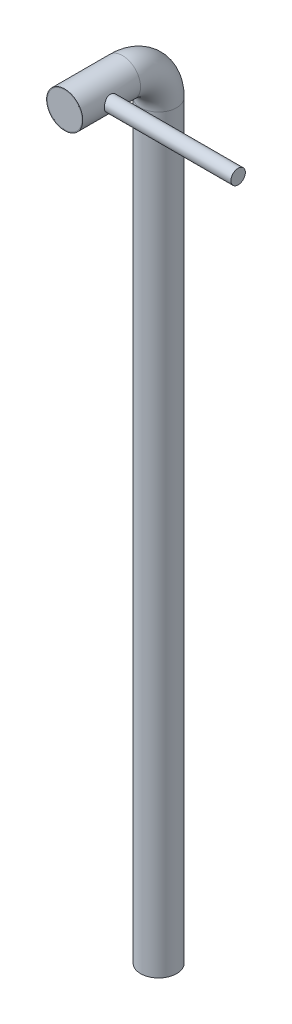
ISO-10303-21;
HEADER;
FILE_DESCRIPTION(('STEP AP214'),'2;1');
FILE_NAME('part.step','',(''),(''),'','','');
FILE_SCHEMA(('AUTOMOTIVE_DESIGN { 1 0 10303 214 1 1 1 1 }'));
ENDSEC;
DATA;
#1=APPLICATION_CONTEXT('core data for automotive mechanical design processes');
#2=APPLICATION_PROTOCOL_DEFINITION('international standard','automotive_design',2000,#1);
#3=PRODUCT_CONTEXT('',#1,'mechanical');
#4=PRODUCT('Part','Part','',(#3));
#5=PRODUCT_RELATED_PRODUCT_CATEGORY('part','',(#4));
#6=PRODUCT_DEFINITION_FORMATION('','',#4);
#7=PRODUCT_DEFINITION_CONTEXT('part definition',#1,'design');
#8=PRODUCT_DEFINITION('design','',#6,#7);
#9=PRODUCT_DEFINITION_SHAPE('','',#8);
#10=(LENGTH_UNIT() NAMED_UNIT(*) SI_UNIT(.MILLI.,.METRE.));
#11=(NAMED_UNIT(*) PLANE_ANGLE_UNIT() SI_UNIT($,.RADIAN.));
#12=(NAMED_UNIT(*) SI_UNIT($,.STERADIAN.) SOLID_ANGLE_UNIT());
#13=UNCERTAINTY_MEASURE_WITH_UNIT(LENGTH_MEASURE(1.E-05),#10,'distance_accuracy_value','');
#14=(GEOMETRIC_REPRESENTATION_CONTEXT(3) GLOBAL_UNCERTAINTY_ASSIGNED_CONTEXT((#13)) GLOBAL_UNIT_ASSIGNED_CONTEXT((#10,
#11,#12)) REPRESENTATION_CONTEXT('',''));
#15=CARTESIAN_POINT('',(0.,0.,0.));
#16=DIRECTION('',(0.,0.,1.));
#17=DIRECTION('',(1.,0.,0.));
#18=AXIS2_PLACEMENT_3D('',#15,#16,#17);
#19=CARTESIAN_POINT('',(0.,0.,13.));
#20=DIRECTION('',(0.,0.,-1.));
#21=DIRECTION('',(-1.,0.,0.));
#22=AXIS2_PLACEMENT_3D('',#19,#20,#21);
#23=PLANE('',#22);
#24=CARTESIAN_POINT('',(0.,80.,13.));
#25=DIRECTION('',(0.,0.,-1.));
#26=DIRECTION('',(-1.,0.,0.));
#27=AXIS2_PLACEMENT_3D('',#24,#25,#26);
#28=CIRCLE('',#27,2.4);
#29=CARTESIAN_POINT('',(-2.4,80.,13.));
#30=VERTEX_POINT('',#29);
#31=EDGE_CURVE('E12',#30,#30,#28,.F.);
#32=ORIENTED_EDGE('',*,*,#31,.F.);
#33=EDGE_LOOP('',(#32));
#34=FACE_BOUND('',#33,.T.);
#35=ADVANCED_FACE('F46',(#34),#23,.T.);
#36=OPEN_SHELL('',(#35));
#37=SHELL_BASED_SURFACE_MODEL('B2',(#36));
#38=CARTESIAN_POINT('',(0.,-28.77,0.));
#39=DIRECTION('',(0.,1.,0.));
#40=DIRECTION('',(1.,0.,0.));
#41=AXIS2_PLACEMENT_3D('',#38,#39,#40);
#42=PLANE('',#41);
#43=CARTESIAN_POINT('',(0.,-28.77,0.));
#44=DIRECTION('',(0.,1.,0.));
#45=DIRECTION('',(1.,0.,0.));
#46=AXIS2_PLACEMENT_3D('',#43,#44,#45);
#47=CIRCLE('',#46,2.5);
#48=CARTESIAN_POINT('',(2.5,-28.77,0.));
#49=VERTEX_POINT('',#48);
#50=EDGE_CURVE('E87',#49,#49,#47,.T.);
#51=ORIENTED_EDGE('',*,*,#50,.F.);
#52=EDGE_LOOP('',(#51));
#53=FACE_BOUND('',#52,.T.);
#54=ADVANCED_FACE('F63',(#53),#42,.F.);
#55=CARTESIAN_POINT('',(0.,80.,13.));
#56=DIRECTION('',(0.,0.,1.));
#57=DIRECTION('',(1.,0.,0.));
#58=AXIS2_PLACEMENT_3D('',#55,#56,#57);
#59=PLANE('',#58);
#60=CARTESIAN_POINT('',(0.,80.,13.));
#61=DIRECTION('',(0.,0.,1.));
#62=DIRECTION('',(1.,0.,0.));
#63=AXIS2_PLACEMENT_3D('',#60,#61,#62);
#64=CIRCLE('',#63,2.4);
#65=CARTESIAN_POINT('',(2.4,80.,13.));
#66=VERTEX_POINT('',#65);
#67=EDGE_CURVE('E90',#66,#66,#64,.T.);
#68=ORIENTED_EDGE('',*,*,#67,.F.);
#69=EDGE_LOOP('',(#68));
#70=FACE_BOUND('',#69,.T.);
#71=CARTESIAN_POINT('',(0.,80.,13.));
#72=DIRECTION('',(0.,0.,1.));
#73=DIRECTION('',(1.,0.,0.));
#74=AXIS2_PLACEMENT_3D('',#71,#72,#73);
#75=CIRCLE('',#74,2.5);
#76=CARTESIAN_POINT('',(2.5,80.,13.));
#77=VERTEX_POINT('',#76);
#78=EDGE_CURVE('E74',#77,#77,#75,.T.);
#79=ORIENTED_EDGE('',*,*,#78,.T.);
#80=EDGE_LOOP('',(#79));
#81=FACE_BOUND('',#80,.T.);
#82=ADVANCED_FACE('F134',(#70,#81),#59,.T.);
#83=CARTESIAN_POINT('',(0.,-28.77,0.));
#84=DIRECTION('',(0.,1.,0.));
#85=DIRECTION('',(0.,0.,1.));
#86=AXIS2_PLACEMENT_3D('',#83,#84,#85);
#87=CYLINDRICAL_SURFACE('',#86,2.5);
#88=CARTESIAN_POINT('',(0.,75.,0.));
#89=DIRECTION('',(0.,1.,0.));
#90=DIRECTION('',(1.,0.,0.));
#91=AXIS2_PLACEMENT_3D('',#88,#89,#90);
#92=CIRCLE('',#91,2.5);
#93=CARTESIAN_POINT('',(0.,75.,-2.5));
#94=VERTEX_POINT('',#93);
#95=EDGE_CURVE('E82',#94,#94,#92,.T.);
#96=ORIENTED_EDGE('',*,*,#95,.F.);
#97=EDGE_LOOP('',(#96));
#98=FACE_BOUND('',#97,.T.);
#99=ORIENTED_EDGE('',*,*,#50,.T.);
#100=EDGE_LOOP('',(#99));
#101=FACE_BOUND('',#100,.T.);
#102=ADVANCED_FACE('F128',(#98,#101),#87,.T.);
#103=CARTESIAN_POINT('',(0.,75.,5.));
#104=DIRECTION('',(1.,0.,0.));
#105=DIRECTION('',(0.,0.,-1.));
#106=AXIS2_PLACEMENT_3D('',#103,#104,#105);
#107=TOROIDAL_SURFACE('',#106,5.,2.5);
#108=CARTESIAN_POINT('',(0.,80.,4.99999999999999));
#109=DIRECTION('',(0.,0.,1.));
#110=DIRECTION('',(1.,0.,0.));
#111=AXIS2_PLACEMENT_3D('',#108,#109,#110);
#112=CIRCLE('',#111,2.5);
#113=CARTESIAN_POINT('',(0.,82.5,4.99999999999998));
#114=VERTEX_POINT('',#113);
#115=EDGE_CURVE('E78',#114,#114,#112,.T.);
#116=CARTESIAN_POINT('',(0.,75.,5.));
#117=DIRECTION('',(1.,0.,0.));
#118=DIRECTION('',(0.,0.,-1.));
#119=AXIS2_PLACEMENT_3D('',#116,#117,#118);
#120=CIRCLE('',#119,7.5);
#121=EDGE_CURVE('',#94,#114,#120,.T.);
#122=ORIENTED_EDGE('',*,*,#95,.T.);
#123=ORIENTED_EDGE('',*,*,#115,.F.);
#124=ORIENTED_EDGE('',*,*,#121,.T.);
#125=ORIENTED_EDGE('',*,*,#121,.F.);
#126=EDGE_LOOP('',(#122,#124,#123,#125));
#127=FACE_BOUND('',#126,.T.);
#128=ADVANCED_FACE('F123',(#127),#107,.T.);
#129=CARTESIAN_POINT('',(0.,80.,5.));
#130=DIRECTION('',(0.,0.,1.));
#131=DIRECTION('',(1.,0.,0.));
#132=AXIS2_PLACEMENT_3D('',#129,#130,#131);
#133=CYLINDRICAL_SURFACE('',#132,2.5);
#134=CARTESIAN_POINT('',(2.5,80.,8.));
#135=CARTESIAN_POINT('',(2.49999635613543,80.0537465027215,8.00000492591186));
#136=CARTESIAN_POINT('',(2.49824647153467,80.1075862820453,8.00435887604418));
#137=CARTESIAN_POINT('',(2.49141726550321,80.213748240209,8.02162385176062));
#138=CARTESIAN_POINT('',(2.48632889349439,80.2660658887806,8.03455813954307));
#139=CARTESIAN_POINT('',(2.47337104606559,80.3674769613637,8.06843803902942));
#140=CARTESIAN_POINT('',(2.46551068182036,80.4165803308085,8.08935742310836));
#141=CARTESIAN_POINT('',(2.44778305398039,80.5105359851642,8.13850958666327));
#142=CARTESIAN_POINT('',(2.43791648729028,80.5553897383755,8.16673982745946));
#143=CARTESIAN_POINT('',(2.41665443085209,80.6417505037852,8.23111774928047));
#144=CARTESIAN_POINT('',(2.40521148464595,80.6830311362751,8.26755332812013));
#145=CARTESIAN_POINT('',(2.38230288453097,80.7590875023924,8.34670000173839));
#146=CARTESIAN_POINT('',(2.37083722226896,80.7938600535668,8.38941414860588));
#147=CARTESIAN_POINT('',(2.34861395898568,80.8574372836464,8.48221403512114));
#148=CARTESIAN_POINT('',(2.33791057982476,80.8859074905977,8.53254324301161));
#149=CARTESIAN_POINT('',(2.31916823593396,80.9338773595186,8.63776819921003));
#150=CARTESIAN_POINT('',(2.31112800622088,80.9533812821429,8.69266176392419));
#151=CARTESIAN_POINT('',(2.29913178830409,80.981949411698,8.80285616679606));
#152=CARTESIAN_POINT('',(2.29500710177803,80.9914469829028,8.85802561778812));
#153=CARTESIAN_POINT('',(2.29082002024572,81.00108648082,8.96931749915364));
#154=CARTESIAN_POINT('',(2.29075562761384,81.0012330081566,9.02543944731251));
#155=CARTESIAN_POINT('',(2.29455250139997,80.9924946837523,9.13287833572903));
#156=CARTESIAN_POINT('',(2.29814087519225,80.9842376571526,9.18425785720452));
#157=CARTESIAN_POINT('',(2.30838093803918,80.9599734401489,9.28482977800336));
#158=CARTESIAN_POINT('',(2.31503316160837,80.9439648974023,9.33402179405516));
#159=CARTESIAN_POINT('',(2.33079742544265,80.9043473662755,9.43000891809803));
#160=CARTESIAN_POINT('',(2.33995689640394,80.8805899311577,9.47673461952735));
#161=CARTESIAN_POINT('',(2.35969058194945,80.8262532303661,9.56570790818079));
#162=CARTESIAN_POINT('',(2.37026532728425,80.7956714025504,9.60795380470141));
#163=CARTESIAN_POINT('',(2.39263368371136,80.7257752997272,9.69020486440101));
#164=CARTESIAN_POINT('',(2.40445832488076,80.6859687314853,9.72978436472301));
#165=CARTESIAN_POINT('',(2.42729912479141,80.6001572137151,9.80184223900103));
#166=CARTESIAN_POINT('',(2.43831512222663,80.5541510326672,9.83431919870515));
#167=CARTESIAN_POINT('',(2.45857340632274,80.4560388263029,9.89180872370792));
#168=CARTESIAN_POINT('',(2.46777635047708,80.4038302456732,9.91666114059853));
#169=CARTESIAN_POINT('',(2.4830741416438,80.2955118827414,9.95708393053903));
#170=CARTESIAN_POINT('',(2.48917056731191,80.2394040984248,9.97265901877871));
#171=CARTESIAN_POINT('',(2.49728069753456,80.1284479438039,9.99322414770985));
#172=CARTESIAN_POINT('',(2.49951472916757,80.0737216469928,9.99878622712678));
#173=CARTESIAN_POINT('',(2.50034239255316,79.9640773450961,10.0008565502643));
#174=CARTESIAN_POINT('',(2.49893696791146,79.909159393388,9.99736714077376));
#175=CARTESIAN_POINT('',(2.49278783531877,79.803283630439,9.98185412372401));
#176=CARTESIAN_POINT('',(2.48819695672762,79.7522587541123,9.97022100982451));
#177=CARTESIAN_POINT('',(2.4762972070275,79.6529322859696,9.93928214584509));
#178=CARTESIAN_POINT('',(2.46898798678265,79.6046310448876,9.91997541016566));
#179=CARTESIAN_POINT('',(2.45208297385406,79.5104606070916,9.87360753016002));
#180=CARTESIAN_POINT('',(2.44242407989902,79.4647109886223,9.84632726397842));
#181=CARTESIAN_POINT('',(2.42186682372762,79.3782782043767,9.78502983804717));
#182=CARTESIAN_POINT('',(2.41096796555135,79.3375970796194,9.75100997853868));
#183=CARTESIAN_POINT('',(2.38822558819056,79.2596384784856,9.67456499352517));
#184=CARTESIAN_POINT('',(2.37636720712526,79.222763033097,9.63173322924688));
#185=CARTESIAN_POINT('',(2.35370836458566,79.1566244012931,9.5402799584953));
#186=CARTESIAN_POINT('',(2.34290807763255,79.1273624693312,9.49165749983002));
#187=CARTESIAN_POINT('',(2.32357149953854,79.0770962490342,9.38926915270295));
#188=CARTESIAN_POINT('',(2.31505815442394,79.0561747027328,9.33545800039385));
#189=CARTESIAN_POINT('',(2.30161836738966,79.0238518901473,9.22463317414242));
#190=CARTESIAN_POINT('',(2.29668927847999,79.0124435973653,9.16762189709378));
#191=CARTESIAN_POINT('',(2.29135879649963,79.0001421913608,9.05643604911272));
#192=CARTESIAN_POINT('',(2.29065710504086,78.9985514588486,9.00235258020332));
#193=CARTESIAN_POINT('',(2.29307418016549,79.0040984203612,8.89472757114335));
#194=CARTESIAN_POINT('',(2.29619246162397,79.0112350060431,8.8411859630487));
#195=CARTESIAN_POINT('',(2.3056332453951,79.0334643169232,8.73833390507247));
#196=CARTESIAN_POINT('',(2.31182415913725,79.0482312532145,8.6889398627835));
#197=CARTESIAN_POINT('',(2.32662000616348,79.0849972757545,8.59331068519325));
#198=CARTESIAN_POINT('',(2.33522560603004,79.1069983593031,8.54707642655008));
#199=CARTESIAN_POINT('',(2.35449304802246,79.1590636186201,8.4561951903646));
#200=CARTESIAN_POINT('',(2.36524441156621,79.1895173324203,8.41179066493475));
#201=CARTESIAN_POINT('',(2.38731902186119,79.2570539403643,8.32850334139811));
#202=CARTESIAN_POINT('',(2.39864244024204,79.2941388325909,8.28962221393583));
#203=CARTESIAN_POINT('',(2.42146783543697,79.3767472468638,8.21589857336818));
#204=CARTESIAN_POINT('',(2.43293378981093,79.4226619994269,8.18148134655096));
#205=CARTESIAN_POINT('',(2.45400203356859,79.5200498398571,8.12083147868918));
#206=CARTESIAN_POINT('',(2.46360345546453,79.5715254977264,8.09460264392373));
#207=CARTESIAN_POINT('',(2.47969857407931,79.6776309687524,8.05168889240485));
#208=CARTESIAN_POINT('',(2.48624681527514,79.7321841908902,8.03483533821983));
#209=CARTESIAN_POINT('',(2.49572153104683,79.8435617268594,8.01068043952286));
#210=CARTESIAN_POINT('',(2.49865949747819,79.9003782370706,8.00334878162804));
#211=CARTESIAN_POINT('',(2.49987949752068,79.9715438510545,8.00030230951086));
#212=CARTESIAN_POINT('',(2.50000096484588,79.9857686556296,7.9999986956854));
#213=CARTESIAN_POINT('',(2.5,80.,8.));
#214=B_SPLINE_CURVE_WITH_KNOTS('',3,(#134,#135,#136,#137,#138,#139,#140,#141,#142,#143,#144,
#145,#146,#147,#148,#149,#150,#151,#152,#153,#154,#155,#156,#157,#158,#159,#160,#161,#162,#163,
#164,#165,#166,#167,#168,#169,#170,#171,#172,#173,#174,#175,#176,#177,#178,#179,#180,#181,#182,
#183,#184,#185,#186,#187,#188,#189,#190,#191,#192,#193,#194,#195,#196,#197,#198,#199,#200,#201,
#202,#203,#204,#205,#206,#207,#208,#209,#210,#211,#212,#213),.UNSPECIFIED.,.T.,.F.,(4,2,2,2,2,2,
2,2,2,2,2,2,2,2,2,2,2,2,2,2,2,2,2,2,2,2,2,2,2,2,2,2,2,2,2,2,2,2,2,4),(0.,0.161201493946544,
0.322841818003976,0.483955728735808,0.645013767839929,0.812986908502003,0.981041974672069,
1.15657629409611,1.33202711559136,1.49952052654416,1.66693153170246,1.82269164200687,
1.97847893628026,2.1374456314941,2.29647210969094,2.4677917459328,2.63914546419868,
2.81388456581404,2.98853478056897,3.15284592264005,3.31711446785043,3.47400227782184,
3.630910244969,3.79261756699134,3.95438979749488,4.1268423731221,4.29932334521876,
4.47347522570416,4.64749836322969,4.80899836696376,4.97047786281526,5.12557159274387,
5.28070817902584,5.4447273402835,5.60879600674199,5.78350211766921,5.95828931820269,
6.12982150506662,6.30080626202173,6.343490229484),.UNSPECIFIED.);
#215=CARTESIAN_POINT('',(2.5,80.,8.));
#216=VERTEX_POINT('',#215);
#217=EDGE_CURVE('E45',#216,#216,#214,.T.);
#218=ORIENTED_EDGE('',*,*,#217,.F.);
#219=EDGE_LOOP('',(#218));
#220=FACE_BOUND('',#219,.T.);
#221=ORIENTED_EDGE('',*,*,#78,.F.);
#222=EDGE_LOOP('',(#221));
#223=FACE_BOUND('',#222,.T.);
#224=ORIENTED_EDGE('',*,*,#115,.T.);
#225=EDGE_LOOP('',(#224));
#226=FACE_BOUND('',#225,.T.);
#227=ADVANCED_FACE('F120',(#220,#223,#226),#133,.T.);
#228=CARTESIAN_POINT('',(0.,-28.67,0.));
#229=DIRECTION('',(0.,1.,0.));
#230=DIRECTION('',(1.,0.,0.));
#231=AXIS2_PLACEMENT_3D('',#228,#229,#230);
#232=PLANE('',#231);
#233=CARTESIAN_POINT('',(0.,-28.67,0.));
#234=DIRECTION('',(0.,1.,0.));
#235=DIRECTION('',(0.,0.,1.));
#236=AXIS2_PLACEMENT_3D('',#233,#234,#235);
#237=CIRCLE('',#236,2.4);
#238=CARTESIAN_POINT('',(0.,-28.67,2.4));
#239=VERTEX_POINT('',#238);
#240=EDGE_CURVE('E99',#239,#239,#237,.T.);
#241=ORIENTED_EDGE('',*,*,#240,.T.);
#242=EDGE_LOOP('',(#241));
#243=FACE_BOUND('',#242,.T.);
#244=ADVANCED_FACE('F110',(#243),#232,.T.);
#245=CARTESIAN_POINT('',(0.,-28.77,0.));
#246=DIRECTION('',(0.,1.,0.));
#247=DIRECTION('',(0.,0.,1.));
#248=AXIS2_PLACEMENT_3D('',#245,#246,#247);
#249=CYLINDRICAL_SURFACE('',#248,2.4);
#250=CARTESIAN_POINT('',(0.,75.,0.));
#251=DIRECTION('',(0.,-1.,0.));
#252=DIRECTION('',(0.,0.,-1.));
#253=AXIS2_PLACEMENT_3D('',#250,#251,#252);
#254=CIRCLE('',#253,2.4);
#255=CARTESIAN_POINT('',(0.,75.,-2.4));
#256=VERTEX_POINT('',#255);
#257=EDGE_CURVE('E96',#256,#256,#254,.F.);
#258=ORIENTED_EDGE('',*,*,#257,.T.);
#259=EDGE_LOOP('',(#258));
#260=FACE_BOUND('',#259,.T.);
#261=ORIENTED_EDGE('',*,*,#240,.F.);
#262=EDGE_LOOP('',(#261));
#263=FACE_BOUND('',#262,.T.);
#264=ADVANCED_FACE('F119',(#260,#263),#249,.F.);
#265=CARTESIAN_POINT('',(0.,75.,5.));
#266=DIRECTION('',(1.,0.,0.));
#267=DIRECTION('',(0.,0.,-1.));
#268=AXIS2_PLACEMENT_3D('',#265,#266,#267);
#269=TOROIDAL_SURFACE('',#268,5.,2.4);
#270=CARTESIAN_POINT('',(0.,80.,4.99999999999999));
#271=DIRECTION('',(0.,0.,1.));
#272=DIRECTION('',(1.,0.,0.));
#273=AXIS2_PLACEMENT_3D('',#270,#271,#272);
#274=CIRCLE('',#273,2.4);
#275=CARTESIAN_POINT('',(0.,82.4,4.99999999999998));
#276=VERTEX_POINT('',#275);
#277=EDGE_CURVE('E93',#276,#276,#274,.T.);
#278=CARTESIAN_POINT('',(0.,75.,5.));
#279=DIRECTION('',(1.,0.,0.));
#280=DIRECTION('',(0.,0.,-1.));
#281=AXIS2_PLACEMENT_3D('',#278,#279,#280);
#282=CIRCLE('',#281,7.4);
#283=EDGE_CURVE('',#256,#276,#282,.T.);
#284=ORIENTED_EDGE('',*,*,#257,.F.);
#285=ORIENTED_EDGE('',*,*,#277,.T.);
#286=ORIENTED_EDGE('',*,*,#283,.T.);
#287=ORIENTED_EDGE('',*,*,#283,.F.);
#288=EDGE_LOOP('',(#284,#286,#285,#287));
#289=FACE_BOUND('',#288,.T.);
#290=ADVANCED_FACE('F147',(#289),#269,.F.);
#291=CARTESIAN_POINT('',(0.,80.,5.));
#292=DIRECTION('',(0.,0.,1.));
#293=DIRECTION('',(1.,0.,0.));
#294=AXIS2_PLACEMENT_3D('',#291,#292,#293);
#295=CYLINDRICAL_SURFACE('',#294,2.4);
#296=ORIENTED_EDGE('',*,*,#67,.T.);
#297=EDGE_LOOP('',(#296));
#298=FACE_BOUND('',#297,.T.);
#299=ORIENTED_EDGE('',*,*,#277,.F.);
#300=EDGE_LOOP('',(#299));
#301=FACE_BOUND('',#300,.T.);
#302=ADVANCED_FACE('F114',(#298,#301),#295,.F.);
#303=CARTESIAN_POINT('',(20.,80.,9.));
#304=DIRECTION('',(1.,0.,0.));
#305=DIRECTION('',(0.,0.,-1.));
#306=AXIS2_PLACEMENT_3D('',#303,#304,#305);
#307=PLANE('',#306);
#308=CARTESIAN_POINT('',(20.,80.,9.));
#309=DIRECTION('',(1.,0.,0.));
#310=DIRECTION('',(0.,0.,-1.));
#311=AXIS2_PLACEMENT_3D('',#308,#309,#310);
#312=CIRCLE('',#311,1.);
#313=CARTESIAN_POINT('',(20.,80.,8.));
#314=VERTEX_POINT('',#313);
#315=EDGE_CURVE('E102',#314,#314,#312,.T.);
#316=ORIENTED_EDGE('',*,*,#315,.T.);
#317=EDGE_LOOP('',(#316));
#318=FACE_BOUND('',#317,.T.);
#319=ADVANCED_FACE('F106',(#318),#307,.T.);
#320=CARTESIAN_POINT('',(-2.502,80.,9.));
#321=DIRECTION('',(1.,0.,0.));
#322=DIRECTION('',(0.,0.,-1.));
#323=AXIS2_PLACEMENT_3D('',#320,#321,#322);
#324=CYLINDRICAL_SURFACE('',#323,1.);
#325=ORIENTED_EDGE('',*,*,#217,.T.);
#326=EDGE_LOOP('',(#325));
#327=FACE_BOUND('',#326,.T.);
#328=ORIENTED_EDGE('',*,*,#315,.F.);
#329=EDGE_LOOP('',(#328));
#330=FACE_BOUND('',#329,.T.);
#331=ADVANCED_FACE('F108',(#327,#330),#324,.T.);
#332=CLOSED_SHELL('',(#54,#82,#102,#128,#227,#244,#264,#290,#302,#319,#331));
#333=MANIFOLD_SOLID_BREP('B7',#332);
#334=ADVANCED_BREP_SHAPE_REPRESENTATION('',(#18,#333),#14);
#335=MANIFOLD_SURFACE_SHAPE_REPRESENTATION('',(#18,#37),#14);
#336=SHAPE_REPRESENTATION('',(#18),#14);
#337=SHAPE_DEFINITION_REPRESENTATION(#9,#336);
#338=SHAPE_REPRESENTATION_RELATIONSHIP('','',#336,#334);
#339=SHAPE_REPRESENTATION_RELATIONSHIP('','',#336,#335);
ENDSEC;
END-ISO-10303-21;
